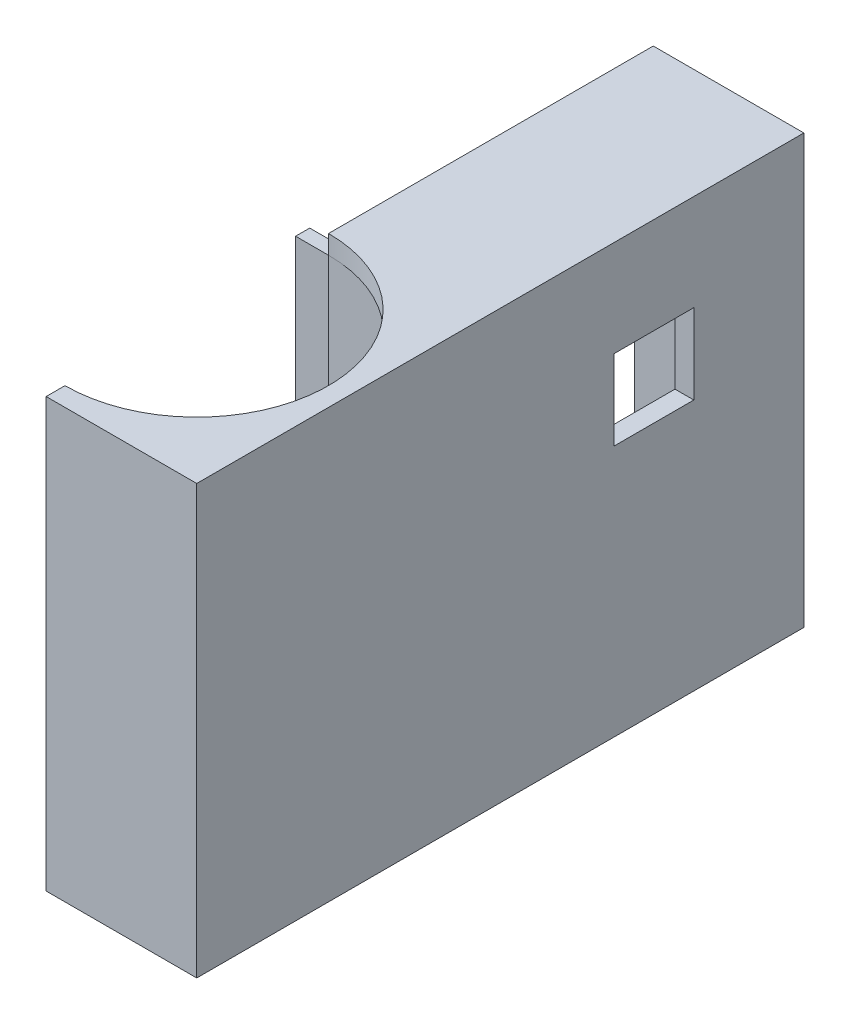
ISO-10303-21;
HEADER;
FILE_DESCRIPTION(('STEP AP214'),'2;1');
FILE_NAME('part.step','',(''),(''),'','','');
FILE_SCHEMA(('AUTOMOTIVE_DESIGN { 1 0 10303 214 1 1 1 1 }'));
ENDSEC;
DATA;
#1=APPLICATION_CONTEXT('core data for automotive mechanical design processes');
#2=APPLICATION_PROTOCOL_DEFINITION('international standard','automotive_design',2000,#1);
#3=PRODUCT_CONTEXT('',#1,'mechanical');
#4=PRODUCT('Part','Part','',(#3));
#5=PRODUCT_RELATED_PRODUCT_CATEGORY('part','',(#4));
#6=PRODUCT_DEFINITION_FORMATION('','',#4);
#7=PRODUCT_DEFINITION_CONTEXT('part definition',#1,'design');
#8=PRODUCT_DEFINITION('design','',#6,#7);
#9=PRODUCT_DEFINITION_SHAPE('','',#8);
#10=(LENGTH_UNIT() NAMED_UNIT(*) SI_UNIT(.MILLI.,.METRE.));
#11=(NAMED_UNIT(*) PLANE_ANGLE_UNIT() SI_UNIT($,.RADIAN.));
#12=(NAMED_UNIT(*) SI_UNIT($,.STERADIAN.) SOLID_ANGLE_UNIT());
#13=UNCERTAINTY_MEASURE_WITH_UNIT(LENGTH_MEASURE(1.E-05),#10,'distance_accuracy_value','');
#14=(GEOMETRIC_REPRESENTATION_CONTEXT(3) GLOBAL_UNCERTAINTY_ASSIGNED_CONTEXT((#13)) GLOBAL_UNIT_ASSIGNED_CONTEXT((#10,
#11,#12)) REPRESENTATION_CONTEXT('',''));
#15=CARTESIAN_POINT('',(0.,0.,0.));
#16=DIRECTION('',(0.,0.,1.));
#17=DIRECTION('',(1.,0.,0.));
#18=AXIS2_PLACEMENT_3D('',#15,#16,#17);
#19=CARTESIAN_POINT('',(-14.,0.,0.));
#20=DIRECTION('',(-1.,0.,0.));
#21=DIRECTION('',(0.,0.,1.));
#22=AXIS2_PLACEMENT_3D('',#19,#20,#21);
#23=PLANE('',#22);
#24=DIRECTION('',(0.,-1.,0.));
#25=VECTOR('',#24,1.);
#26=CARTESIAN_POINT('',(-14.,0.,-54.88));
#27=LINE('',#26,#25);
#28=CARTESIAN_POINT('',(-14.,0.,-54.88));
#29=VERTEX_POINT('',#28);
#30=CARTESIAN_POINT('',(-14.,-2.,-54.88));
#31=VERTEX_POINT('',#30);
#32=EDGE_CURVE('E219',#29,#31,#27,.T.);
#33=ORIENTED_EDGE('',*,*,#32,.F.);
#34=DIRECTION('',(0.,0.,1.));
#35=VECTOR('',#34,1.);
#36=CARTESIAN_POINT('',(-14.,0.,-60.5));
#37=LINE('',#36,#35);
#38=CARTESIAN_POINT('',(-14.,0.,-60.5));
#39=VERTEX_POINT('',#38);
#40=EDGE_CURVE('E362',#39,#29,#37,.T.);
#41=ORIENTED_EDGE('',*,*,#40,.F.);
#42=DIRECTION('',(0.,-1.,0.));
#43=VECTOR('',#42,1.);
#44=CARTESIAN_POINT('',(-14.,41.5,-60.5));
#45=LINE('',#44,#43);
#46=CARTESIAN_POINT('',(-14.,41.5,-60.5));
#47=VERTEX_POINT('',#46);
#48=EDGE_CURVE('E357',#47,#39,#45,.T.);
#49=ORIENTED_EDGE('',*,*,#48,.F.);
#50=DIRECTION('',(0.,0.,-1.));
#51=VECTOR('',#50,1.);
#52=CARTESIAN_POINT('',(-14.,41.5,-60.5));
#53=LINE('',#52,#51);
#54=CARTESIAN_POINT('',(-14.,41.5,-32.5));
#55=VERTEX_POINT('',#54);
#56=EDGE_CURVE('E354',#55,#47,#53,.T.);
#57=ORIENTED_EDGE('',*,*,#56,.F.);
#58=DIRECTION('',(0.,1.,0.));
#59=VECTOR('',#58,1.);
#60=CARTESIAN_POINT('',(-14.,41.5,-32.5));
#61=LINE('',#60,#59);
#62=CARTESIAN_POINT('',(-14.,0.,-32.5));
#63=VERTEX_POINT('',#62);
#64=EDGE_CURVE('E366',#63,#55,#61,.T.);
#65=ORIENTED_EDGE('',*,*,#64,.F.);
#66=CARTESIAN_POINT('',(-14.,0.,-39.64));
#67=VERTEX_POINT('',#66);
#68=EDGE_CURVE('E361',#67,#63,#37,.T.);
#69=ORIENTED_EDGE('',*,*,#68,.F.);
#70=DIRECTION('',(0.,1.,0.));
#71=VECTOR('',#70,1.);
#72=CARTESIAN_POINT('',(-14.,0.,-39.64));
#73=LINE('',#72,#71);
#74=CARTESIAN_POINT('',(-14.,-2.,-39.64));
#75=VERTEX_POINT('',#74);
#76=EDGE_CURVE('E234',#75,#67,#73,.T.);
#77=ORIENTED_EDGE('',*,*,#76,.F.);
#78=DIRECTION('',(0.,0.,1.));
#79=VECTOR('',#78,1.);
#80=CARTESIAN_POINT('',(-14.,-2.,-62.5));
#81=LINE('',#80,#79);
#82=CARTESIAN_POINT('',(-14.,-2.,2.));
#83=VERTEX_POINT('',#82);
#84=EDGE_CURVE('E399',#75,#83,#81,.T.);
#85=ORIENTED_EDGE('',*,*,#84,.T.);
#86=DIRECTION('',(0.,1.,0.));
#87=VECTOR('',#86,1.);
#88=CARTESIAN_POINT('',(-14.,43.5,2.));
#89=LINE('',#88,#87);
#90=CARTESIAN_POINT('',(-14.,43.5,2.));
#91=VERTEX_POINT('',#90);
#92=EDGE_CURVE('E403',#83,#91,#89,.T.);
#93=ORIENTED_EDGE('',*,*,#92,.T.);
#94=DIRECTION('',(0.,0.,-1.));
#95=VECTOR('',#94,1.);
#96=CARTESIAN_POINT('',(-14.,43.5,-62.5));
#97=LINE('',#96,#95);
#98=CARTESIAN_POINT('',(-14.,43.5,0.));
#99=VERTEX_POINT('',#98);
#100=EDGE_CURVE('E408',#91,#99,#97,.T.);
#101=ORIENTED_EDGE('',*,*,#100,.T.);
#102=DIRECTION('',(0.,1.,0.));
#103=VECTOR('',#102,1.);
#104=CARTESIAN_POINT('',(-14.,-2.001,0.));
#105=LINE('',#104,#103);
#106=CARTESIAN_POINT('',(-14.,41.5,0.));
#107=VERTEX_POINT('',#106);
#108=EDGE_CURVE('E301',#99,#107,#105,.F.);
#109=ORIENTED_EDGE('',*,*,#108,.T.);
#110=DIRECTION('',(0.,1.,0.));
#111=VECTOR('',#110,1.);
#112=CARTESIAN_POINT('',(-14.,41.5,0.));
#113=LINE('',#112,#111);
#114=CARTESIAN_POINT('',(-14.,0.,0.));
#115=VERTEX_POINT('',#114);
#116=EDGE_CURVE('E317',#115,#107,#113,.T.);
#117=ORIENTED_EDGE('',*,*,#116,.F.);
#118=DIRECTION('',(0.,0.,1.));
#119=VECTOR('',#118,1.);
#120=CARTESIAN_POINT('',(-14.,0.,-28.));
#121=LINE('',#120,#119);
#122=CARTESIAN_POINT('',(-14.,0.,-28.));
#123=VERTEX_POINT('',#122);
#124=EDGE_CURVE('E314',#123,#115,#121,.T.);
#125=ORIENTED_EDGE('',*,*,#124,.F.);
#126=DIRECTION('',(0.,-1.,0.));
#127=VECTOR('',#126,1.);
#128=CARTESIAN_POINT('',(-14.,41.5,-28.));
#129=LINE('',#128,#127);
#130=CARTESIAN_POINT('',(-14.,41.5,-28.));
#131=VERTEX_POINT('',#130);
#132=EDGE_CURVE('E322',#131,#123,#129,.T.);
#133=ORIENTED_EDGE('',*,*,#132,.F.);
#134=DIRECTION('',(0.,1.,0.));
#135=VECTOR('',#134,1.);
#136=CARTESIAN_POINT('',(-14.,-2.001,-28.));
#137=LINE('',#136,#135);
#138=CARTESIAN_POINT('',(-14.,43.5,-28.));
#139=VERTEX_POINT('',#138);
#140=EDGE_CURVE('E297',#131,#139,#137,.T.);
#141=ORIENTED_EDGE('',*,*,#140,.T.);
#142=CARTESIAN_POINT('',(-14.,43.5,-62.5));
#143=VERTEX_POINT('',#142);
#144=EDGE_CURVE('E407',#139,#143,#97,.T.);
#145=ORIENTED_EDGE('',*,*,#144,.T.);
#146=DIRECTION('',(0.,-1.,0.));
#147=VECTOR('',#146,1.);
#148=CARTESIAN_POINT('',(-14.,43.5,-62.5));
#149=LINE('',#148,#147);
#150=CARTESIAN_POINT('',(-14.,-2.,-62.5));
#151=VERTEX_POINT('',#150);
#152=EDGE_CURVE('E395',#143,#151,#149,.T.);
#153=ORIENTED_EDGE('',*,*,#152,.T.);
#154=EDGE_CURVE('E400',#151,#31,#81,.T.);
#155=ORIENTED_EDGE('',*,*,#154,.T.);
#156=EDGE_LOOP('',(#33,#41,#49,#57,#65,#69,#77,#85,#93,#101,#109,#117,#125,#133,#141,#145,#153,#155));
#157=FACE_BOUND('',#156,.T.);
#158=DIRECTION('',(0.,0.,1.));
#159=VECTOR('',#158,1.);
#160=CARTESIAN_POINT('',(-14.,1.5,-31.));
#161=LINE('',#160,#159);
#162=CARTESIAN_POINT('',(-14.,1.5,-31.));
#163=VERTEX_POINT('',#162);
#164=CARTESIAN_POINT('',(-14.,1.5,-29.5));
#165=VERTEX_POINT('',#164);
#166=EDGE_CURVE('E277',#163,#165,#161,.T.);
#167=ORIENTED_EDGE('',*,*,#166,.F.);
#168=DIRECTION('',(0.,-1.,0.));
#169=VECTOR('',#168,1.);
#170=CARTESIAN_POINT('',(-14.,40.,-31.));
#171=LINE('',#170,#169);
#172=CARTESIAN_POINT('',(-14.,40.,-31.));
#173=VERTEX_POINT('',#172);
#174=EDGE_CURVE('E252',#173,#163,#171,.T.);
#175=ORIENTED_EDGE('',*,*,#174,.F.);
#176=DIRECTION('',(0.,0.,-1.));
#177=VECTOR('',#176,1.);
#178=CARTESIAN_POINT('',(-14.,40.,-31.));
#179=LINE('',#178,#177);
#180=CARTESIAN_POINT('',(-14.,40.,-29.5));
#181=VERTEX_POINT('',#180);
#182=EDGE_CURVE('E264',#181,#173,#179,.T.);
#183=ORIENTED_EDGE('',*,*,#182,.F.);
#184=DIRECTION('',(0.,1.,0.));
#185=VECTOR('',#184,1.);
#186=CARTESIAN_POINT('',(-14.,40.,-29.5));
#187=LINE('',#186,#185);
#188=EDGE_CURVE('E280',#165,#181,#187,.T.);
#189=ORIENTED_EDGE('',*,*,#188,.F.);
#190=EDGE_LOOP('',(#167,#175,#183,#189));
#191=FACE_BOUND('',#190,.T.);
#192=ADVANCED_FACE('F42',(#157,#191),#23,.T.);
#193=CARTESIAN_POINT('',(-14.,41.5,-28.));
#194=DIRECTION('',(0.,-1.,0.));
#195=DIRECTION('',(0.,0.,-1.));
#196=AXIS2_PLACEMENT_3D('',#193,#194,#195);
#197=PLANE('',#196);
#198=CARTESIAN_POINT('',(-14.,41.5,-14.));
#199=DIRECTION('',(0.,-1.,0.));
#200=DIRECTION('',(0.,0.,-1.));
#201=AXIS2_PLACEMENT_3D('',#198,#199,#200);
#202=CIRCLE('',#201,14.);
#203=CARTESIAN_POINT('',(0.,41.5,-14.));
#204=VERTEX_POINT('',#203);
#205=EDGE_CURVE('E308',#204,#131,#202,.F.);
#206=ORIENTED_EDGE('',*,*,#205,.T.);
#207=DIRECTION('',(1.,0.,0.));
#208=VECTOR('',#207,1.);
#209=CARTESIAN_POINT('',(-14.,41.5,-28.));
#210=LINE('',#209,#208);
#211=CARTESIAN_POINT('',(0.,41.5,-28.));
#212=VERTEX_POINT('',#211);
#213=EDGE_CURVE('E341',#131,#212,#210,.T.);
#214=ORIENTED_EDGE('',*,*,#213,.T.);
#215=DIRECTION('',(0.,0.,-1.));
#216=VECTOR('',#215,1.);
#217=CARTESIAN_POINT('',(0.,41.5,-28.));
#218=LINE('',#217,#216);
#219=EDGE_CURVE('E331',#204,#212,#218,.T.);
#220=ORIENTED_EDGE('',*,*,#219,.F.);
#221=EDGE_LOOP('',(#206,#214,#220));
#222=FACE_BOUND('',#221,.T.);
#223=ADVANCED_FACE('F525',(#222),#197,.T.);
#224=CARTESIAN_POINT('',(0.,0.,0.));
#225=DIRECTION('',(-1.,0.,0.));
#226=DIRECTION('',(0.,0.,1.));
#227=AXIS2_PLACEMENT_3D('',#224,#225,#226);
#228=PLANE('',#227);
#229=DIRECTION('',(0.,0.,-1.));
#230=VECTOR('',#229,1.);
#231=CARTESIAN_POINT('',(0.,41.5,-60.5));
#232=LINE('',#231,#230);
#233=CARTESIAN_POINT('',(0.,41.5,-32.5));
#234=VERTEX_POINT('',#233);
#235=CARTESIAN_POINT('',(0.,41.5,-60.5));
#236=VERTEX_POINT('',#235);
#237=EDGE_CURVE('E353',#234,#236,#232,.T.);
#238=ORIENTED_EDGE('',*,*,#237,.T.);
#239=DIRECTION('',(0.,-1.,0.));
#240=VECTOR('',#239,1.);
#241=CARTESIAN_POINT('',(0.,41.5,-60.5));
#242=LINE('',#241,#240);
#243=CARTESIAN_POINT('',(0.,0.,-60.5));
#244=VERTEX_POINT('',#243);
#245=EDGE_CURVE('E372',#236,#244,#242,.T.);
#246=ORIENTED_EDGE('',*,*,#245,.T.);
#247=DIRECTION('',(0.,0.,1.));
#248=VECTOR('',#247,1.);
#249=CARTESIAN_POINT('',(0.,0.,-60.5));
#250=LINE('',#249,#248);
#251=CARTESIAN_POINT('',(0.,0.,-32.5));
#252=VERTEX_POINT('',#251);
#253=EDGE_CURVE('E375',#244,#252,#250,.T.);
#254=ORIENTED_EDGE('',*,*,#253,.T.);
#255=DIRECTION('',(0.,1.,0.));
#256=VECTOR('',#255,1.);
#257=CARTESIAN_POINT('',(0.,41.5,-32.5));
#258=LINE('',#257,#256);
#259=EDGE_CURVE('E358',#252,#234,#258,.T.);
#260=ORIENTED_EDGE('',*,*,#259,.T.);
#261=EDGE_LOOP('',(#238,#246,#254,#260));
#262=FACE_BOUND('',#261,.T.);
#263=DIRECTION('',(0.,0.,1.));
#264=VECTOR('',#263,1.);
#265=CARTESIAN_POINT('',(0.,33.274,-42.3090026));
#266=LINE('',#265,#264);
#267=CARTESIAN_POINT('',(0.,33.274,-50.8090026));
#268=VERTEX_POINT('',#267);
#269=CARTESIAN_POINT('',(0.,33.274,-42.3090026));
#270=VERTEX_POINT('',#269);
#271=EDGE_CURVE('E417',#268,#270,#266,.T.);
#272=ORIENTED_EDGE('',*,*,#271,.T.);
#273=DIRECTION('',(0.,-1.,0.));
#274=VECTOR('',#273,1.);
#275=CARTESIAN_POINT('',(0.,33.274,-42.3090026));
#276=LINE('',#275,#274);
#277=CARTESIAN_POINT('',(0.,24.774,-42.3090026));
#278=VERTEX_POINT('',#277);
#279=EDGE_CURVE('E412',#270,#278,#276,.T.);
#280=ORIENTED_EDGE('',*,*,#279,.T.);
#281=DIRECTION('',(0.,0.,-1.));
#282=VECTOR('',#281,1.);
#283=CARTESIAN_POINT('',(0.,24.774,-42.3090026));
#284=LINE('',#283,#282);
#285=CARTESIAN_POINT('',(0.,24.774,-50.8090026));
#286=VERTEX_POINT('',#285);
#287=EDGE_CURVE('E431',#278,#286,#284,.T.);
#288=ORIENTED_EDGE('',*,*,#287,.T.);
#289=DIRECTION('',(0.,1.,0.));
#290=VECTOR('',#289,1.);
#291=CARTESIAN_POINT('',(0.,33.274,-50.8090026));
#292=LINE('',#291,#290);
#293=EDGE_CURVE('E435',#286,#268,#292,.T.);
#294=ORIENTED_EDGE('',*,*,#293,.T.);
#295=EDGE_LOOP('',(#272,#280,#288,#294));
#296=FACE_BOUND('',#295,.T.);
#297=ADVANCED_FACE('F552',(#262,#296),#228,.T.);
#298=CARTESIAN_POINT('',(2.,0.,0.));
#299=DIRECTION('',(-1.,0.,0.));
#300=DIRECTION('',(0.,0.,1.));
#301=AXIS2_PLACEMENT_3D('',#298,#299,#300);
#302=PLANE('',#301);
#303=DIRECTION('',(0.,-1.,0.));
#304=VECTOR('',#303,1.);
#305=CARTESIAN_POINT('',(2.,-2.,2.));
#306=LINE('',#305,#304);
#307=CARTESIAN_POINT('',(2.,43.5,2.));
#308=VERTEX_POINT('',#307);
#309=CARTESIAN_POINT('',(2.,-2.,2.));
#310=VERTEX_POINT('',#309);
#311=EDGE_CURVE('E455',#308,#310,#306,.T.);
#312=ORIENTED_EDGE('',*,*,#311,.T.);
#313=DIRECTION('',(0.,0.,-1.));
#314=VECTOR('',#313,1.);
#315=CARTESIAN_POINT('',(2.,-2.,2.));
#316=LINE('',#315,#314);
#317=CARTESIAN_POINT('',(2.,-2.,-62.5));
#318=VERTEX_POINT('',#317);
#319=EDGE_CURVE('E459',#310,#318,#316,.T.);
#320=ORIENTED_EDGE('',*,*,#319,.T.);
#321=DIRECTION('',(0.,1.,0.));
#322=VECTOR('',#321,1.);
#323=CARTESIAN_POINT('',(2.,-2.,-62.5));
#324=LINE('',#323,#322);
#325=CARTESIAN_POINT('',(2.,43.5,-62.5));
#326=VERTEX_POINT('',#325);
#327=EDGE_CURVE('E462',#318,#326,#324,.T.);
#328=ORIENTED_EDGE('',*,*,#327,.T.);
#329=DIRECTION('',(0.,0.,1.));
#330=VECTOR('',#329,1.);
#331=CARTESIAN_POINT('',(2.,43.5,2.));
#332=LINE('',#331,#330);
#333=EDGE_CURVE('E465',#326,#308,#332,.T.);
#334=ORIENTED_EDGE('',*,*,#333,.T.);
#335=EDGE_LOOP('',(#312,#320,#328,#334));
#336=FACE_BOUND('',#335,.T.);
#337=DIRECTION('',(0.,-1.,0.));
#338=VECTOR('',#337,1.);
#339=CARTESIAN_POINT('',(2.,33.274,-42.3090026));
#340=LINE('',#339,#338);
#341=CARTESIAN_POINT('',(2.,33.274,-42.3090026));
#342=VERTEX_POINT('',#341);
#343=CARTESIAN_POINT('',(2.,24.774,-42.3090026));
#344=VERTEX_POINT('',#343);
#345=EDGE_CURVE('E413',#342,#344,#340,.T.);
#346=ORIENTED_EDGE('',*,*,#345,.F.);
#347=DIRECTION('',(0.,0.,1.));
#348=VECTOR('',#347,1.);
#349=CARTESIAN_POINT('',(2.,33.274,-42.3090026));
#350=LINE('',#349,#348);
#351=CARTESIAN_POINT('',(2.,33.274,-50.8090026));
#352=VERTEX_POINT('',#351);
#353=EDGE_CURVE('E424',#352,#342,#350,.T.);
#354=ORIENTED_EDGE('',*,*,#353,.F.);
#355=DIRECTION('',(0.,1.,0.));
#356=VECTOR('',#355,1.);
#357=CARTESIAN_POINT('',(2.,33.274,-50.8090026));
#358=LINE('',#357,#356);
#359=CARTESIAN_POINT('',(2.,24.774,-50.8090026));
#360=VERTEX_POINT('',#359);
#361=EDGE_CURVE('E420',#360,#352,#358,.T.);
#362=ORIENTED_EDGE('',*,*,#361,.F.);
#363=DIRECTION('',(0.,0.,-1.));
#364=VECTOR('',#363,1.);
#365=CARTESIAN_POINT('',(2.,24.774,-42.3090026));
#366=LINE('',#365,#364);
#367=EDGE_CURVE('E416',#344,#360,#366,.T.);
#368=ORIENTED_EDGE('',*,*,#367,.F.);
#369=EDGE_LOOP('',(#346,#354,#362,#368));
#370=FACE_BOUND('',#369,.T.);
#371=ADVANCED_FACE('F494',(#336,#370),#302,.F.);
#372=CARTESIAN_POINT('',(2.,-2.,2.));
#373=DIRECTION('',(0.,0.,-1.));
#374=DIRECTION('',(-1.,0.,0.));
#375=AXIS2_PLACEMENT_3D('',#372,#373,#374);
#376=PLANE('',#375);
#377=DIRECTION('',(-1.,0.,0.));
#378=VECTOR('',#377,1.);
#379=CARTESIAN_POINT('',(2.,43.5,2.));
#380=LINE('',#379,#378);
#381=EDGE_CURVE('E468',#308,#91,#380,.T.);
#382=ORIENTED_EDGE('',*,*,#381,.T.);
#383=ORIENTED_EDGE('',*,*,#92,.F.);
#384=DIRECTION('',(-1.,0.,0.));
#385=VECTOR('',#384,1.);
#386=CARTESIAN_POINT('',(2.,-2.,2.));
#387=LINE('',#386,#385);
#388=EDGE_CURVE('E11',#310,#83,#387,.T.);
#389=ORIENTED_EDGE('',*,*,#388,.F.);
#390=ORIENTED_EDGE('',*,*,#311,.F.);
#391=EDGE_LOOP('',(#382,#383,#389,#390));
#392=FACE_BOUND('',#391,.T.);
#393=ADVANCED_FACE('F44',(#392),#376,.F.);
#394=CARTESIAN_POINT('',(2.,-2.,2.));
#395=DIRECTION('',(0.,1.,0.));
#396=DIRECTION('',(0.,0.,1.));
#397=AXIS2_PLACEMENT_3D('',#394,#395,#396);
#398=PLANE('',#397);
#399=DIRECTION('',(0.,0.,1.));
#400=VECTOR('',#399,1.);
#401=CARTESIAN_POINT('',(-6.38,-2.,-54.88));
#402=LINE('',#401,#400);
#403=CARTESIAN_POINT('',(-6.38,-2.,-54.88));
#404=VERTEX_POINT('',#403);
#405=CARTESIAN_POINT('',(-6.38,-2.,-39.64));
#406=VERTEX_POINT('',#405);
#407=EDGE_CURVE('E229',#404,#406,#402,.T.);
#408=ORIENTED_EDGE('',*,*,#407,.F.);
#409=DIRECTION('',(-1.,0.,0.));
#410=VECTOR('',#409,1.);
#411=CARTESIAN_POINT('',(-6.38,-2.,-54.88));
#412=LINE('',#411,#410);
#413=EDGE_CURVE('E214',#404,#31,#412,.T.);
#414=ORIENTED_EDGE('',*,*,#413,.T.);
#415=ORIENTED_EDGE('',*,*,#154,.F.);
#416=DIRECTION('',(-1.,0.,0.));
#417=VECTOR('',#416,1.);
#418=CARTESIAN_POINT('',(2.,-2.,-62.5));
#419=LINE('',#418,#417);
#420=EDGE_CURVE('E51',#318,#151,#419,.T.);
#421=ORIENTED_EDGE('',*,*,#420,.F.);
#422=ORIENTED_EDGE('',*,*,#319,.F.);
#423=ORIENTED_EDGE('',*,*,#388,.T.);
#424=ORIENTED_EDGE('',*,*,#84,.F.);
#425=DIRECTION('',(-1.,0.,0.));
#426=VECTOR('',#425,1.);
#427=CARTESIAN_POINT('',(-6.38,-2.,-39.64));
#428=LINE('',#427,#426);
#429=EDGE_CURVE('E225',#406,#75,#428,.T.);
#430=ORIENTED_EDGE('',*,*,#429,.F.);
#431=EDGE_LOOP('',(#408,#414,#415,#421,#422,#423,#424,#430));
#432=FACE_BOUND('',#431,.T.);
#433=ADVANCED_FACE('F236',(#432),#398,.F.);
#434=CARTESIAN_POINT('',(2.,-2.,-62.5));
#435=DIRECTION('',(0.,0.,1.));
#436=DIRECTION('',(1.,0.,0.));
#437=AXIS2_PLACEMENT_3D('',#434,#435,#436);
#438=PLANE('',#437);
#439=ORIENTED_EDGE('',*,*,#420,.T.);
#440=ORIENTED_EDGE('',*,*,#152,.F.);
#441=DIRECTION('',(-1.,0.,0.));
#442=VECTOR('',#441,1.);
#443=CARTESIAN_POINT('',(2.,43.5,-62.5));
#444=LINE('',#443,#442);
#445=EDGE_CURVE('E471',#326,#143,#444,.T.);
#446=ORIENTED_EDGE('',*,*,#445,.F.);
#447=ORIENTED_EDGE('',*,*,#327,.F.);
#448=EDGE_LOOP('',(#439,#440,#446,#447));
#449=FACE_BOUND('',#448,.T.);
#450=ADVANCED_FACE('F479',(#449),#438,.F.);
#451=CARTESIAN_POINT('',(2.,43.5,2.));
#452=DIRECTION('',(0.,-1.,0.));
#453=DIRECTION('',(0.,0.,-1.));
#454=AXIS2_PLACEMENT_3D('',#451,#452,#453);
#455=PLANE('',#454);
#456=ORIENTED_EDGE('',*,*,#144,.F.);
#457=CARTESIAN_POINT('',(-14.,43.5,-14.));
#458=DIRECTION('',(0.,1.,0.));
#459=DIRECTION('',(0.,0.,1.));
#460=AXIS2_PLACEMENT_3D('',#457,#458,#459);
#461=CIRCLE('',#460,14.);
#462=EDGE_CURVE('E305',#99,#139,#461,.T.);
#463=ORIENTED_EDGE('',*,*,#462,.F.);
#464=ORIENTED_EDGE('',*,*,#100,.F.);
#465=ORIENTED_EDGE('',*,*,#381,.F.);
#466=ORIENTED_EDGE('',*,*,#333,.F.);
#467=ORIENTED_EDGE('',*,*,#445,.T.);
#468=EDGE_LOOP('',(#456,#463,#464,#465,#466,#467));
#469=FACE_BOUND('',#468,.T.);
#470=ADVANCED_FACE('F489',(#469),#455,.F.);
#471=CARTESIAN_POINT('',(2.,33.274,-42.3090026));
#472=DIRECTION('',(0.,0.,-1.));
#473=DIRECTION('',(-1.,0.,0.));
#474=AXIS2_PLACEMENT_3D('',#471,#472,#473);
#475=PLANE('',#474);
#476=ORIENTED_EDGE('',*,*,#279,.F.);
#477=DIRECTION('',(-1.,0.,0.));
#478=VECTOR('',#477,1.);
#479=CARTESIAN_POINT('',(2.,33.274,-42.3090026));
#480=LINE('',#479,#478);
#481=EDGE_CURVE('E427',#342,#270,#480,.T.);
#482=ORIENTED_EDGE('',*,*,#481,.F.);
#483=ORIENTED_EDGE('',*,*,#345,.T.);
#484=DIRECTION('',(-1.,0.,0.));
#485=VECTOR('',#484,1.);
#486=CARTESIAN_POINT('',(2.,24.774,-42.3090026));
#487=LINE('',#486,#485);
#488=EDGE_CURVE('E451',#344,#278,#487,.T.);
#489=ORIENTED_EDGE('',*,*,#488,.T.);
#490=EDGE_LOOP('',(#476,#482,#483,#489));
#491=FACE_BOUND('',#490,.T.);
#492=ADVANCED_FACE('F564',(#491),#475,.T.);
#493=CARTESIAN_POINT('',(2.,24.774,-42.3090026));
#494=DIRECTION('',(0.,1.,0.));
#495=DIRECTION('',(0.,0.,1.));
#496=AXIS2_PLACEMENT_3D('',#493,#494,#495);
#497=PLANE('',#496);
#498=ORIENTED_EDGE('',*,*,#287,.F.);
#499=ORIENTED_EDGE('',*,*,#488,.F.);
#500=ORIENTED_EDGE('',*,*,#367,.T.);
#501=DIRECTION('',(-1.,0.,0.));
#502=VECTOR('',#501,1.);
#503=CARTESIAN_POINT('',(2.,24.774,-50.8090026));
#504=LINE('',#503,#502);
#505=EDGE_CURVE('E448',#360,#286,#504,.T.);
#506=ORIENTED_EDGE('',*,*,#505,.T.);
#507=EDGE_LOOP('',(#498,#499,#500,#506));
#508=FACE_BOUND('',#507,.T.);
#509=ADVANCED_FACE('F570',(#508),#497,.T.);
#510=CARTESIAN_POINT('',(2.,33.274,-50.8090026));
#511=DIRECTION('',(0.,0.,1.));
#512=DIRECTION('',(1.,0.,0.));
#513=AXIS2_PLACEMENT_3D('',#510,#511,#512);
#514=PLANE('',#513);
#515=ORIENTED_EDGE('',*,*,#293,.F.);
#516=ORIENTED_EDGE('',*,*,#505,.F.);
#517=ORIENTED_EDGE('',*,*,#361,.T.);
#518=DIRECTION('',(-1.,0.,0.));
#519=VECTOR('',#518,1.);
#520=CARTESIAN_POINT('',(2.,33.274,-50.8090026));
#521=LINE('',#520,#519);
#522=EDGE_CURVE('E445',#352,#268,#521,.T.);
#523=ORIENTED_EDGE('',*,*,#522,.T.);
#524=EDGE_LOOP('',(#515,#516,#517,#523));
#525=FACE_BOUND('',#524,.T.);
#526=ADVANCED_FACE('F572',(#525),#514,.T.);
#527=CARTESIAN_POINT('',(2.,33.274,-42.3090026));
#528=DIRECTION('',(0.,-1.,0.));
#529=DIRECTION('',(0.,0.,-1.));
#530=AXIS2_PLACEMENT_3D('',#527,#528,#529);
#531=PLANE('',#530);
#532=ORIENTED_EDGE('',*,*,#271,.F.);
#533=ORIENTED_EDGE('',*,*,#522,.F.);
#534=ORIENTED_EDGE('',*,*,#353,.T.);
#535=ORIENTED_EDGE('',*,*,#481,.T.);
#536=EDGE_LOOP('',(#532,#533,#534,#535));
#537=FACE_BOUND('',#536,.T.);
#538=ADVANCED_FACE('F559',(#537),#531,.T.);
#539=CARTESIAN_POINT('',(-14.,41.5,-60.5));
#540=DIRECTION('',(0.,-1.,0.));
#541=DIRECTION('',(0.,0.,-1.));
#542=AXIS2_PLACEMENT_3D('',#539,#540,#541);
#543=PLANE('',#542);
#544=ORIENTED_EDGE('',*,*,#237,.F.);
#545=DIRECTION('',(1.,0.,0.));
#546=VECTOR('',#545,1.);
#547=CARTESIAN_POINT('',(-14.,41.5,-32.5));
#548=LINE('',#547,#546);
#549=EDGE_CURVE('E369',#55,#234,#548,.T.);
#550=ORIENTED_EDGE('',*,*,#549,.F.);
#551=ORIENTED_EDGE('',*,*,#56,.T.);
#552=DIRECTION('',(1.,0.,0.));
#553=VECTOR('',#552,1.);
#554=CARTESIAN_POINT('',(-14.,41.5,-60.5));
#555=LINE('',#554,#553);
#556=EDGE_CURVE('E391',#47,#236,#555,.T.);
#557=ORIENTED_EDGE('',*,*,#556,.T.);
#558=EDGE_LOOP('',(#544,#550,#551,#557));
#559=FACE_BOUND('',#558,.T.);
#560=ADVANCED_FACE('F546',(#559),#543,.T.);
#561=CARTESIAN_POINT('',(-14.,41.5,-60.5));
#562=DIRECTION('',(0.,0.,1.));
#563=DIRECTION('',(1.,0.,0.));
#564=AXIS2_PLACEMENT_3D('',#561,#562,#563);
#565=PLANE('',#564);
#566=ORIENTED_EDGE('',*,*,#245,.F.);
#567=ORIENTED_EDGE('',*,*,#556,.F.);
#568=ORIENTED_EDGE('',*,*,#48,.T.);
#569=DIRECTION('',(1.,0.,0.));
#570=VECTOR('',#569,1.);
#571=CARTESIAN_POINT('',(-14.,0.,-60.5));
#572=LINE('',#571,#570);
#573=EDGE_CURVE('E387',#39,#244,#572,.T.);
#574=ORIENTED_EDGE('',*,*,#573,.T.);
#575=EDGE_LOOP('',(#566,#567,#568,#574));
#576=FACE_BOUND('',#575,.T.);
#577=ADVANCED_FACE('F549',(#576),#565,.T.);
#578=CARTESIAN_POINT('',(-14.,0.,-60.5));
#579=DIRECTION('',(0.,1.,0.));
#580=DIRECTION('',(0.,0.,1.));
#581=AXIS2_PLACEMENT_3D('',#578,#579,#580);
#582=PLANE('',#581);
#583=DIRECTION('',(-1.,0.,0.));
#584=VECTOR('',#583,1.);
#585=CARTESIAN_POINT('',(-6.38,0.,-54.88));
#586=LINE('',#585,#584);
#587=CARTESIAN_POINT('',(-6.38,0.,-54.88));
#588=VERTEX_POINT('',#587);
#589=EDGE_CURVE('E249',#588,#29,#586,.T.);
#590=ORIENTED_EDGE('',*,*,#589,.F.);
#591=DIRECTION('',(0.,0.,-1.));
#592=VECTOR('',#591,1.);
#593=CARTESIAN_POINT('',(-6.38,0.,-54.88));
#594=LINE('',#593,#592);
#595=CARTESIAN_POINT('',(-6.38,0.,-39.64));
#596=VERTEX_POINT('',#595);
#597=EDGE_CURVE('E226',#596,#588,#594,.T.);
#598=ORIENTED_EDGE('',*,*,#597,.F.);
#599=DIRECTION('',(-1.,0.,0.));
#600=VECTOR('',#599,1.);
#601=CARTESIAN_POINT('',(-6.38,0.,-39.64));
#602=LINE('',#601,#600);
#603=EDGE_CURVE('E253',#596,#67,#602,.T.);
#604=ORIENTED_EDGE('',*,*,#603,.T.);
#605=ORIENTED_EDGE('',*,*,#68,.T.);
#606=DIRECTION('',(1.,0.,0.));
#607=VECTOR('',#606,1.);
#608=CARTESIAN_POINT('',(-14.,0.,-32.5));
#609=LINE('',#608,#607);
#610=EDGE_CURVE('E383',#63,#252,#609,.T.);
#611=ORIENTED_EDGE('',*,*,#610,.T.);
#612=ORIENTED_EDGE('',*,*,#253,.F.);
#613=ORIENTED_EDGE('',*,*,#573,.F.);
#614=ORIENTED_EDGE('',*,*,#40,.T.);
#615=EDGE_LOOP('',(#590,#598,#604,#605,#611,#612,#613,#614));
#616=FACE_BOUND('',#615,.T.);
#617=ADVANCED_FACE('F533',(#616),#582,.T.);
#618=CARTESIAN_POINT('',(-14.,41.5,-32.5));
#619=DIRECTION('',(0.,0.,-1.));
#620=DIRECTION('',(0.,1.,0.));
#621=AXIS2_PLACEMENT_3D('',#618,#619,#620);
#622=PLANE('',#621);
#623=ORIENTED_EDGE('',*,*,#259,.F.);
#624=ORIENTED_EDGE('',*,*,#610,.F.);
#625=ORIENTED_EDGE('',*,*,#64,.T.);
#626=ORIENTED_EDGE('',*,*,#549,.T.);
#627=EDGE_LOOP('',(#623,#624,#625,#626));
#628=FACE_BOUND('',#627,.T.);
#629=ADVANCED_FACE('F538',(#628),#622,.T.);
#630=CARTESIAN_POINT('',(-14.,0.,-28.));
#631=DIRECTION('',(0.,1.,0.));
#632=DIRECTION('',(0.,0.,1.));
#633=AXIS2_PLACEMENT_3D('',#630,#631,#632);
#634=PLANE('',#633);
#635=DIRECTION('',(0.,0.,1.));
#636=VECTOR('',#635,1.);
#637=CARTESIAN_POINT('',(0.,0.,-28.));
#638=LINE('',#637,#636);
#639=CARTESIAN_POINT('',(0.,0.,-28.));
#640=VERTEX_POINT('',#639);
#641=CARTESIAN_POINT('',(0.,0.,0.));
#642=VERTEX_POINT('',#641);
#643=EDGE_CURVE('E313',#640,#642,#638,.T.);
#644=ORIENTED_EDGE('',*,*,#643,.F.);
#645=DIRECTION('',(1.,0.,0.));
#646=VECTOR('',#645,1.);
#647=CARTESIAN_POINT('',(-14.,0.,-28.));
#648=LINE('',#647,#646);
#649=EDGE_CURVE('E325',#123,#640,#648,.T.);
#650=ORIENTED_EDGE('',*,*,#649,.F.);
#651=ORIENTED_EDGE('',*,*,#124,.T.);
#652=DIRECTION('',(1.,0.,0.));
#653=VECTOR('',#652,1.);
#654=CARTESIAN_POINT('',(-14.,0.,0.));
#655=LINE('',#654,#653);
#656=EDGE_CURVE('E349',#115,#642,#655,.T.);
#657=ORIENTED_EDGE('',*,*,#656,.T.);
#658=EDGE_LOOP('',(#644,#650,#651,#657));
#659=FACE_BOUND('',#658,.T.);
#660=ADVANCED_FACE('F518',(#659),#634,.T.);
#661=CARTESIAN_POINT('',(-14.,41.5,0.));
#662=DIRECTION('',(0.,0.,-1.));
#663=DIRECTION('',(-1.,0.,0.));
#664=AXIS2_PLACEMENT_3D('',#661,#662,#663);
#665=PLANE('',#664);
#666=DIRECTION('',(0.,1.,0.));
#667=VECTOR('',#666,1.);
#668=CARTESIAN_POINT('',(0.,41.5,0.));
#669=LINE('',#668,#667);
#670=CARTESIAN_POINT('',(0.,41.5,0.));
#671=VERTEX_POINT('',#670);
#672=EDGE_CURVE('E328',#642,#671,#669,.T.);
#673=ORIENTED_EDGE('',*,*,#672,.F.);
#674=ORIENTED_EDGE('',*,*,#656,.F.);
#675=ORIENTED_EDGE('',*,*,#116,.T.);
#676=DIRECTION('',(1.,0.,0.));
#677=VECTOR('',#676,1.);
#678=CARTESIAN_POINT('',(-14.,41.5,0.));
#679=LINE('',#678,#677);
#680=EDGE_CURVE('E345',#107,#671,#679,.T.);
#681=ORIENTED_EDGE('',*,*,#680,.T.);
#682=EDGE_LOOP('',(#673,#674,#675,#681));
#683=FACE_BOUND('',#682,.T.);
#684=ADVANCED_FACE('F509',(#683),#665,.T.);
#685=EDGE_CURVE('E309',#107,#204,#202,.F.);
#686=ORIENTED_EDGE('',*,*,#685,.T.);
#687=EDGE_CURVE('E332',#671,#204,#218,.T.);
#688=ORIENTED_EDGE('',*,*,#687,.F.);
#689=ORIENTED_EDGE('',*,*,#680,.F.);
#690=EDGE_LOOP('',(#686,#688,#689));
#691=FACE_BOUND('',#690,.T.);
#692=ADVANCED_FACE('F512',(#691),#197,.T.);
#693=CARTESIAN_POINT('',(-14.,41.5,-28.));
#694=DIRECTION('',(0.,0.,1.));
#695=DIRECTION('',(0.,-1.,0.));
#696=AXIS2_PLACEMENT_3D('',#693,#694,#695);
#697=PLANE('',#696);
#698=DIRECTION('',(0.,-1.,0.));
#699=VECTOR('',#698,1.);
#700=CARTESIAN_POINT('',(0.,41.5,-28.));
#701=LINE('',#700,#699);
#702=EDGE_CURVE('E318',#212,#640,#701,.T.);
#703=ORIENTED_EDGE('',*,*,#702,.F.);
#704=ORIENTED_EDGE('',*,*,#213,.F.);
#705=ORIENTED_EDGE('',*,*,#132,.T.);
#706=ORIENTED_EDGE('',*,*,#649,.T.);
#707=EDGE_LOOP('',(#703,#704,#705,#706));
#708=FACE_BOUND('',#707,.T.);
#709=ADVANCED_FACE('F523',(#708),#697,.T.);
#710=ORIENTED_EDGE('',*,*,#643,.T.);
#711=ORIENTED_EDGE('',*,*,#672,.T.);
#712=ORIENTED_EDGE('',*,*,#687,.T.);
#713=ORIENTED_EDGE('',*,*,#219,.T.);
#714=ORIENTED_EDGE('',*,*,#702,.T.);
#715=EDGE_LOOP('',(#710,#711,#712,#713,#714));
#716=FACE_BOUND('',#715,.T.);
#717=ADVANCED_FACE('F515',(#716),#228,.T.);
#718=CARTESIAN_POINT('',(-14.,-2.001,-14.));
#719=DIRECTION('',(0.,1.,0.));
#720=DIRECTION('',(0.,0.,1.));
#721=AXIS2_PLACEMENT_3D('',#718,#719,#720);
#722=CYLINDRICAL_SURFACE('',#721,14.);
#723=ORIENTED_EDGE('',*,*,#462,.T.);
#724=ORIENTED_EDGE('',*,*,#140,.F.);
#725=ORIENTED_EDGE('',*,*,#205,.F.);
#726=ORIENTED_EDGE('',*,*,#685,.F.);
#727=ORIENTED_EDGE('',*,*,#108,.F.);
#728=EDGE_LOOP('',(#723,#724,#725,#726,#727));
#729=FACE_BOUND('',#728,.T.);
#730=ADVANCED_FACE('F501',(#729),#722,.F.);
#731=CARTESIAN_POINT('',(-19.,40.,-31.));
#732=DIRECTION('',(0.,0.,1.));
#733=DIRECTION('',(0.,-1.,0.));
#734=AXIS2_PLACEMENT_3D('',#731,#732,#733);
#735=PLANE('',#734);
#736=ORIENTED_EDGE('',*,*,#174,.T.);
#737=DIRECTION('',(1.,0.,0.));
#738=VECTOR('',#737,1.);
#739=CARTESIAN_POINT('',(-19.,1.5,-31.));
#740=LINE('',#739,#738);
#741=CARTESIAN_POINT('',(-19.,1.5,-31.));
#742=VERTEX_POINT('',#741);
#743=EDGE_CURVE('E294',#742,#163,#740,.T.);
#744=ORIENTED_EDGE('',*,*,#743,.F.);
#745=DIRECTION('',(0.,-1.,0.));
#746=VECTOR('',#745,1.);
#747=CARTESIAN_POINT('',(-19.,40.,-31.));
#748=LINE('',#747,#746);
#749=CARTESIAN_POINT('',(-19.,40.,-31.));
#750=VERTEX_POINT('',#749);
#751=EDGE_CURVE('E259',#750,#742,#748,.T.);
#752=ORIENTED_EDGE('',*,*,#751,.F.);
#753=DIRECTION('',(1.,0.,0.));
#754=VECTOR('',#753,1.);
#755=CARTESIAN_POINT('',(-19.,40.,-31.));
#756=LINE('',#755,#754);
#757=EDGE_CURVE('E273',#750,#173,#756,.T.);
#758=ORIENTED_EDGE('',*,*,#757,.T.);
#759=EDGE_LOOP('',(#736,#744,#752,#758));
#760=FACE_BOUND('',#759,.T.);
#761=ADVANCED_FACE('F607',(#760),#735,.F.);
#762=CARTESIAN_POINT('',(-19.,1.5,-31.));
#763=DIRECTION('',(0.,1.,0.));
#764=DIRECTION('',(0.,0.,1.));
#765=AXIS2_PLACEMENT_3D('',#762,#763,#764);
#766=PLANE('',#765);
#767=ORIENTED_EDGE('',*,*,#166,.T.);
#768=DIRECTION('',(1.,0.,0.));
#769=VECTOR('',#768,1.);
#770=CARTESIAN_POINT('',(-19.,1.5,-29.5));
#771=LINE('',#770,#769);
#772=CARTESIAN_POINT('',(-19.,1.5,-29.5));
#773=VERTEX_POINT('',#772);
#774=EDGE_CURVE('E290',#773,#165,#771,.T.);
#775=ORIENTED_EDGE('',*,*,#774,.F.);
#776=DIRECTION('',(0.,0.,1.));
#777=VECTOR('',#776,1.);
#778=CARTESIAN_POINT('',(-19.,1.5,-31.));
#779=LINE('',#778,#777);
#780=EDGE_CURVE('E263',#742,#773,#779,.T.);
#781=ORIENTED_EDGE('',*,*,#780,.F.);
#782=ORIENTED_EDGE('',*,*,#743,.T.);
#783=EDGE_LOOP('',(#767,#775,#781,#782));
#784=FACE_BOUND('',#783,.T.);
#785=ADVANCED_FACE('F610',(#784),#766,.F.);
#786=CARTESIAN_POINT('',(-19.,40.,-29.5));
#787=DIRECTION('',(0.,0.,-1.));
#788=DIRECTION('',(0.,1.,0.));
#789=AXIS2_PLACEMENT_3D('',#786,#787,#788);
#790=PLANE('',#789);
#791=ORIENTED_EDGE('',*,*,#188,.T.);
#792=DIRECTION('',(1.,0.,0.));
#793=VECTOR('',#792,1.);
#794=CARTESIAN_POINT('',(-19.,40.,-29.5));
#795=LINE('',#794,#793);
#796=CARTESIAN_POINT('',(-19.,40.,-29.5));
#797=VERTEX_POINT('',#796);
#798=EDGE_CURVE('E66',#797,#181,#795,.T.);
#799=ORIENTED_EDGE('',*,*,#798,.F.);
#800=DIRECTION('',(0.,1.,0.));
#801=VECTOR('',#800,1.);
#802=CARTESIAN_POINT('',(-19.,40.,-29.5));
#803=LINE('',#802,#801);
#804=EDGE_CURVE('E267',#773,#797,#803,.T.);
#805=ORIENTED_EDGE('',*,*,#804,.F.);
#806=ORIENTED_EDGE('',*,*,#774,.T.);
#807=EDGE_LOOP('',(#791,#799,#805,#806));
#808=FACE_BOUND('',#807,.T.);
#809=ADVANCED_FACE('F614',(#808),#790,.F.);
#810=CARTESIAN_POINT('',(-19.,40.,-31.));
#811=DIRECTION('',(0.,-1.,0.));
#812=DIRECTION('',(0.,0.,-1.));
#813=AXIS2_PLACEMENT_3D('',#810,#811,#812);
#814=PLANE('',#813);
#815=ORIENTED_EDGE('',*,*,#182,.T.);
#816=ORIENTED_EDGE('',*,*,#757,.F.);
#817=DIRECTION('',(0.,0.,-1.));
#818=VECTOR('',#817,1.);
#819=CARTESIAN_POINT('',(-19.,40.,-31.));
#820=LINE('',#819,#818);
#821=EDGE_CURVE('E270',#797,#750,#820,.T.);
#822=ORIENTED_EDGE('',*,*,#821,.F.);
#823=ORIENTED_EDGE('',*,*,#798,.T.);
#824=EDGE_LOOP('',(#815,#816,#822,#823));
#825=FACE_BOUND('',#824,.T.);
#826=ADVANCED_FACE('F618',(#825),#814,.F.);
#827=CARTESIAN_POINT('',(-19.,0.,0.));
#828=DIRECTION('',(-1.,0.,0.));
#829=DIRECTION('',(0.,0.,1.));
#830=AXIS2_PLACEMENT_3D('',#827,#828,#829);
#831=PLANE('',#830);
#832=ORIENTED_EDGE('',*,*,#751,.T.);
#833=ORIENTED_EDGE('',*,*,#780,.T.);
#834=ORIENTED_EDGE('',*,*,#804,.T.);
#835=ORIENTED_EDGE('',*,*,#821,.T.);
#836=EDGE_LOOP('',(#832,#833,#834,#835));
#837=FACE_BOUND('',#836,.T.);
#838=ADVANCED_FACE('F622',(#837),#831,.T.);
#839=CARTESIAN_POINT('',(-6.38,0.,-54.88));
#840=DIRECTION('',(0.,0.,-1.));
#841=DIRECTION('',(-1.,0.,0.));
#842=AXIS2_PLACEMENT_3D('',#839,#840,#841);
#843=PLANE('',#842);
#844=ORIENTED_EDGE('',*,*,#32,.T.);
#845=ORIENTED_EDGE('',*,*,#413,.F.);
#846=DIRECTION('',(0.,-1.,0.));
#847=VECTOR('',#846,1.);
#848=CARTESIAN_POINT('',(-6.38,0.,-54.88));
#849=LINE('',#848,#847);
#850=EDGE_CURVE('E217',#588,#404,#849,.T.);
#851=ORIENTED_EDGE('',*,*,#850,.F.);
#852=ORIENTED_EDGE('',*,*,#589,.T.);
#853=EDGE_LOOP('',(#844,#845,#851,#852));
#854=FACE_BOUND('',#853,.T.);
#855=ADVANCED_FACE('F216',(#854),#843,.F.);
#856=CARTESIAN_POINT('',(-6.38,0.,-39.64));
#857=DIRECTION('',(0.,0.,1.));
#858=DIRECTION('',(1.,0.,0.));
#859=AXIS2_PLACEMENT_3D('',#856,#857,#858);
#860=PLANE('',#859);
#861=ORIENTED_EDGE('',*,*,#76,.T.);
#862=ORIENTED_EDGE('',*,*,#603,.F.);
#863=DIRECTION('',(0.,1.,0.));
#864=VECTOR('',#863,1.);
#865=CARTESIAN_POINT('',(-6.38,0.,-39.64));
#866=LINE('',#865,#864);
#867=EDGE_CURVE('E58',#406,#596,#866,.T.);
#868=ORIENTED_EDGE('',*,*,#867,.F.);
#869=ORIENTED_EDGE('',*,*,#429,.T.);
#870=EDGE_LOOP('',(#861,#862,#868,#869));
#871=FACE_BOUND('',#870,.T.);
#872=ADVANCED_FACE('F628',(#871),#860,.F.);
#873=CARTESIAN_POINT('',(-6.38,0.,0.));
#874=DIRECTION('',(-1.,0.,0.));
#875=DIRECTION('',(0.,0.,1.));
#876=AXIS2_PLACEMENT_3D('',#873,#874,#875);
#877=PLANE('',#876);
#878=ORIENTED_EDGE('',*,*,#850,.T.);
#879=ORIENTED_EDGE('',*,*,#407,.T.);
#880=ORIENTED_EDGE('',*,*,#867,.T.);
#881=ORIENTED_EDGE('',*,*,#597,.T.);
#882=EDGE_LOOP('',(#878,#879,#880,#881));
#883=FACE_BOUND('',#882,.T.);
#884=ADVANCED_FACE('F228',(#883),#877,.T.);
#885=CLOSED_SHELL('',(#192,#223,#297,#371,#393,#433,#450,#470,#492,#509,#526,#538,#560,#577,
#617,#629,#660,#684,#692,#709,#717,#730,#761,#785,#809,#826,#838,#855,#872,#884));
#886=MANIFOLD_SOLID_BREP('B2',#885);
#887=ADVANCED_BREP_SHAPE_REPRESENTATION('',(#18,#886),#14);
#888=SHAPE_DEFINITION_REPRESENTATION(#9,#887);
ENDSEC;
END-ISO-10303-21;
